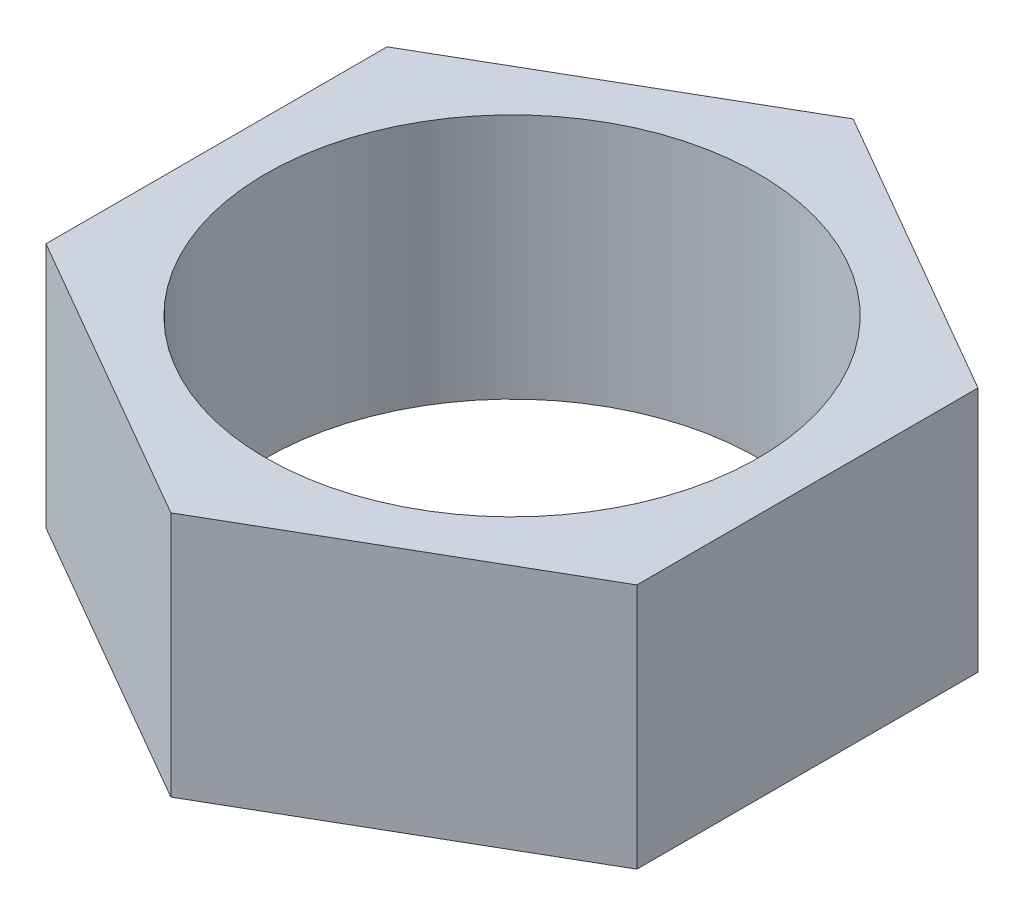
ISO-10303-21;
HEADER;
FILE_DESCRIPTION(('STEP AP214'),'2;1');
FILE_NAME('part.step','',(''),(''),'','','');
FILE_SCHEMA(('AUTOMOTIVE_DESIGN { 1 0 10303 214 1 1 1 1 }'));
ENDSEC;
DATA;
#1=APPLICATION_CONTEXT('core data for automotive mechanical design processes');
#2=APPLICATION_PROTOCOL_DEFINITION('international standard','automotive_design',2000,#1);
#3=PRODUCT_CONTEXT('',#1,'mechanical');
#4=PRODUCT('Part','Part','',(#3));
#5=PRODUCT_RELATED_PRODUCT_CATEGORY('part','',(#4));
#6=PRODUCT_DEFINITION_FORMATION('','',#4);
#7=PRODUCT_DEFINITION_CONTEXT('part definition',#1,'design');
#8=PRODUCT_DEFINITION('design','',#6,#7);
#9=PRODUCT_DEFINITION_SHAPE('','',#8);
#10=(LENGTH_UNIT() NAMED_UNIT(*) SI_UNIT(.MILLI.,.METRE.));
#11=(NAMED_UNIT(*) PLANE_ANGLE_UNIT() SI_UNIT($,.RADIAN.));
#12=(NAMED_UNIT(*) SI_UNIT($,.STERADIAN.) SOLID_ANGLE_UNIT());
#13=UNCERTAINTY_MEASURE_WITH_UNIT(LENGTH_MEASURE(1.E-05),#10,'distance_accuracy_value','');
#14=(GEOMETRIC_REPRESENTATION_CONTEXT(3) GLOBAL_UNCERTAINTY_ASSIGNED_CONTEXT((#13)) GLOBAL_UNIT_ASSIGNED_CONTEXT((#10,
#11,#12)) REPRESENTATION_CONTEXT('',''));
#15=CARTESIAN_POINT('',(0.,0.,0.));
#16=DIRECTION('',(0.,0.,1.));
#17=DIRECTION('',(1.,0.,0.));
#18=AXIS2_PLACEMENT_3D('',#15,#16,#17);
#19=CARTESIAN_POINT('',(0.,0.25,-0.346410161513775));
#20=DIRECTION('',(0.5,0.,0.866025403784439));
#21=DIRECTION('',(0.866025403784439,0.,-0.5));
#22=AXIS2_PLACEMENT_3D('',#19,#20,#21);
#23=PLANE('',#22);
#24=DIRECTION('',(-0.866025403784439,0.,0.5));
#25=VECTOR('',#24,1.);
#26=CARTESIAN_POINT('',(0.,0.,-0.346410161513775));
#27=LINE('',#26,#25);
#28=CARTESIAN_POINT('',(0.,0.,-0.346410161513775));
#29=VERTEX_POINT('',#28);
#30=CARTESIAN_POINT('',(-0.3,0.,-0.173205080756888));
#31=VERTEX_POINT('',#30);
#32=EDGE_CURVE('E117',#29,#31,#27,.T.);
#33=ORIENTED_EDGE('',*,*,#32,.T.);
#34=DIRECTION('',(0.,-1.,0.));
#35=VECTOR('',#34,1.);
#36=CARTESIAN_POINT('',(-0.3,0.25,-0.173205080756888));
#37=LINE('',#36,#35);
#38=CARTESIAN_POINT('',(-0.3,0.25,-0.173205080756888));
#39=VERTEX_POINT('',#38);
#40=EDGE_CURVE('E11',#39,#31,#37,.T.);
#41=ORIENTED_EDGE('',*,*,#40,.F.);
#42=DIRECTION('',(-0.866025403784439,0.,0.5));
#43=VECTOR('',#42,1.);
#44=CARTESIAN_POINT('',(0.,0.25,-0.346410161513775));
#45=LINE('',#44,#43);
#46=CARTESIAN_POINT('',(0.,0.25,-0.346410161513775));
#47=VERTEX_POINT('',#46);
#48=EDGE_CURVE('E128',#47,#39,#45,.T.);
#49=ORIENTED_EDGE('',*,*,#48,.F.);
#50=DIRECTION('',(0.,-1.,0.));
#51=VECTOR('',#50,1.);
#52=CARTESIAN_POINT('',(0.,0.25,-0.346410161513775));
#53=LINE('',#52,#51);
#54=EDGE_CURVE('E113',#47,#29,#53,.T.);
#55=ORIENTED_EDGE('',*,*,#54,.T.);
#56=EDGE_LOOP('',(#33,#41,#49,#55));
#57=FACE_BOUND('',#56,.T.);
#58=ADVANCED_FACE('F33',(#57),#23,.F.);
#59=CARTESIAN_POINT('',(-0.3,0.25,-0.173205080756888));
#60=DIRECTION('',(1.,0.,0.));
#61=DIRECTION('',(0.,0.,-1.));
#62=AXIS2_PLACEMENT_3D('',#59,#60,#61);
#63=PLANE('',#62);
#64=DIRECTION('',(0.,0.,1.));
#65=VECTOR('',#64,1.);
#66=CARTESIAN_POINT('',(-0.3,0.,-0.173205080756888));
#67=LINE('',#66,#65);
#68=CARTESIAN_POINT('',(-0.3,0.,0.173205080756888));
#69=VERTEX_POINT('',#68);
#70=EDGE_CURVE('E120',#31,#69,#67,.T.);
#71=ORIENTED_EDGE('',*,*,#70,.T.);
#72=DIRECTION('',(0.,-1.,0.));
#73=VECTOR('',#72,1.);
#74=CARTESIAN_POINT('',(-0.3,0.25,0.173205080756888));
#75=LINE('',#74,#73);
#76=CARTESIAN_POINT('',(-0.3,0.25,0.173205080756888));
#77=VERTEX_POINT('',#76);
#78=EDGE_CURVE('E41',#77,#69,#75,.T.);
#79=ORIENTED_EDGE('',*,*,#78,.F.);
#80=DIRECTION('',(0.,0.,1.));
#81=VECTOR('',#80,1.);
#82=CARTESIAN_POINT('',(-0.3,0.25,-0.173205080756888));
#83=LINE('',#82,#81);
#84=EDGE_CURVE('E86',#39,#77,#83,.T.);
#85=ORIENTED_EDGE('',*,*,#84,.F.);
#86=ORIENTED_EDGE('',*,*,#40,.T.);
#87=EDGE_LOOP('',(#71,#79,#85,#86));
#88=FACE_BOUND('',#87,.T.);
#89=ADVANCED_FACE('F153',(#88),#63,.F.);
#90=CARTESIAN_POINT('',(-0.3,0.25,0.173205080756888));
#91=DIRECTION('',(0.5,0.,-0.866025403784439));
#92=DIRECTION('',(-0.866025403784438,0.,-0.5));
#93=AXIS2_PLACEMENT_3D('',#90,#91,#92);
#94=PLANE('',#93);
#95=DIRECTION('',(0.866025403784438,0.,0.5));
#96=VECTOR('',#95,1.);
#97=CARTESIAN_POINT('',(-0.3,0.,0.173205080756888));
#98=LINE('',#97,#96);
#99=CARTESIAN_POINT('',(0.,0.,0.346410161513775));
#100=VERTEX_POINT('',#99);
#101=EDGE_CURVE('E123',#69,#100,#98,.T.);
#102=ORIENTED_EDGE('',*,*,#101,.T.);
#103=DIRECTION('',(0.,-1.,0.));
#104=VECTOR('',#103,1.);
#105=CARTESIAN_POINT('',(0.,0.25,0.346410161513775));
#106=LINE('',#105,#104);
#107=CARTESIAN_POINT('',(0.,0.25,0.346410161513775));
#108=VERTEX_POINT('',#107);
#109=EDGE_CURVE('E108',#108,#100,#106,.T.);
#110=ORIENTED_EDGE('',*,*,#109,.F.);
#111=DIRECTION('',(0.866025403784438,0.,0.5));
#112=VECTOR('',#111,1.);
#113=CARTESIAN_POINT('',(-0.3,0.25,0.173205080756888));
#114=LINE('',#113,#112);
#115=EDGE_CURVE('E99',#77,#108,#114,.T.);
#116=ORIENTED_EDGE('',*,*,#115,.F.);
#117=ORIENTED_EDGE('',*,*,#78,.T.);
#118=EDGE_LOOP('',(#102,#110,#116,#117));
#119=FACE_BOUND('',#118,.T.);
#120=ADVANCED_FACE('F134',(#119),#94,.F.);
#121=CARTESIAN_POINT('',(0.,0.25,0.346410161513775));
#122=DIRECTION('',(-0.5,0.,-0.866025403784438));
#123=DIRECTION('',(-0.866025403784438,0.,0.5));
#124=AXIS2_PLACEMENT_3D('',#121,#122,#123);
#125=PLANE('',#124);
#126=DIRECTION('',(0.866025403784438,0.,-0.5));
#127=VECTOR('',#126,1.);
#128=CARTESIAN_POINT('',(0.,0.,0.346410161513775));
#129=LINE('',#128,#127);
#130=CARTESIAN_POINT('',(0.3,0.,0.173205080756887));
#131=VERTEX_POINT('',#130);
#132=EDGE_CURVE('E107',#100,#131,#129,.T.);
#133=ORIENTED_EDGE('',*,*,#132,.T.);
#134=DIRECTION('',(0.,-1.,0.));
#135=VECTOR('',#134,1.);
#136=CARTESIAN_POINT('',(0.3,0.25,0.173205080756887));
#137=LINE('',#136,#135);
#138=CARTESIAN_POINT('',(0.3,0.25,0.173205080756887));
#139=VERTEX_POINT('',#138);
#140=EDGE_CURVE('E104',#139,#131,#137,.T.);
#141=ORIENTED_EDGE('',*,*,#140,.F.);
#142=DIRECTION('',(0.866025403784438,0.,-0.5));
#143=VECTOR('',#142,1.);
#144=CARTESIAN_POINT('',(0.,0.25,0.346410161513775));
#145=LINE('',#144,#143);
#146=EDGE_CURVE('E93',#108,#139,#145,.T.);
#147=ORIENTED_EDGE('',*,*,#146,.F.);
#148=ORIENTED_EDGE('',*,*,#109,.T.);
#149=EDGE_LOOP('',(#133,#141,#147,#148));
#150=FACE_BOUND('',#149,.T.);
#151=ADVANCED_FACE('F105',(#150),#125,.F.);
#152=CARTESIAN_POINT('',(0.3,0.25,0.173205080756887));
#153=DIRECTION('',(-1.,0.,0.));
#154=DIRECTION('',(0.,0.,1.));
#155=AXIS2_PLACEMENT_3D('',#152,#153,#154);
#156=PLANE('',#155);
#157=DIRECTION('',(0.,0.,-1.));
#158=VECTOR('',#157,1.);
#159=CARTESIAN_POINT('',(0.3,0.,0.173205080756887));
#160=LINE('',#159,#158);
#161=CARTESIAN_POINT('',(0.3,0.,-0.173205080756888));
#162=VERTEX_POINT('',#161);
#163=EDGE_CURVE('E72',#131,#162,#160,.T.);
#164=ORIENTED_EDGE('',*,*,#163,.T.);
#165=DIRECTION('',(0.,-1.,0.));
#166=VECTOR('',#165,1.);
#167=CARTESIAN_POINT('',(0.3,0.25,-0.173205080756888));
#168=LINE('',#167,#166);
#169=CARTESIAN_POINT('',(0.3,0.25,-0.173205080756888));
#170=VERTEX_POINT('',#169);
#171=EDGE_CURVE('E109',#170,#162,#168,.T.);
#172=ORIENTED_EDGE('',*,*,#171,.F.);
#173=DIRECTION('',(0.,0.,-1.));
#174=VECTOR('',#173,1.);
#175=CARTESIAN_POINT('',(0.3,0.25,0.173205080756887));
#176=LINE('',#175,#174);
#177=EDGE_CURVE('E97',#139,#170,#176,.T.);
#178=ORIENTED_EDGE('',*,*,#177,.F.);
#179=ORIENTED_EDGE('',*,*,#140,.T.);
#180=EDGE_LOOP('',(#164,#172,#178,#179));
#181=FACE_BOUND('',#180,.T.);
#182=ADVANCED_FACE('F111',(#181),#156,.F.);
#183=CARTESIAN_POINT('',(0.3,0.25,-0.173205080756888));
#184=DIRECTION('',(-0.5,0.,0.866025403784439));
#185=DIRECTION('',(0.866025403784439,0.,0.5));
#186=AXIS2_PLACEMENT_3D('',#183,#184,#185);
#187=PLANE('',#186);
#188=DIRECTION('',(-0.866025403784439,0.,-0.5));
#189=VECTOR('',#188,1.);
#190=CARTESIAN_POINT('',(0.3,0.,-0.173205080756888));
#191=LINE('',#190,#189);
#192=EDGE_CURVE('E78',#162,#29,#191,.T.);
#193=ORIENTED_EDGE('',*,*,#192,.T.);
#194=ORIENTED_EDGE('',*,*,#54,.F.);
#195=DIRECTION('',(-0.866025403784439,0.,-0.5));
#196=VECTOR('',#195,1.);
#197=CARTESIAN_POINT('',(0.3,0.25,-0.173205080756888));
#198=LINE('',#197,#196);
#199=EDGE_CURVE('E49',#170,#47,#198,.T.);
#200=ORIENTED_EDGE('',*,*,#199,.F.);
#201=ORIENTED_EDGE('',*,*,#171,.T.);
#202=EDGE_LOOP('',(#193,#194,#200,#201));
#203=FACE_BOUND('',#202,.T.);
#204=ADVANCED_FACE('F141',(#203),#187,.F.);
#205=CARTESIAN_POINT('',(0.,0.25,0.));
#206=DIRECTION('',(0.,1.,0.));
#207=DIRECTION('',(0.,0.,1.));
#208=AXIS2_PLACEMENT_3D('',#205,#206,#207);
#209=PLANE('',#208);
#210=CARTESIAN_POINT('',(0.,0.25,0.));
#211=DIRECTION('',(0.,1.,0.));
#212=DIRECTION('',(0.,0.,1.));
#213=AXIS2_PLACEMENT_3D('',#210,#211,#212);
#214=CIRCLE('',#213,0.25);
#215=CARTESIAN_POINT('',(0.,0.25,0.25));
#216=VERTEX_POINT('',#215);
#217=EDGE_CURVE('E208',#216,#216,#214,.T.);
#218=ORIENTED_EDGE('',*,*,#217,.F.);
#219=EDGE_LOOP('',(#218));
#220=FACE_BOUND('',#219,.T.);
#221=ORIENTED_EDGE('',*,*,#48,.T.);
#222=ORIENTED_EDGE('',*,*,#84,.T.);
#223=ORIENTED_EDGE('',*,*,#115,.T.);
#224=ORIENTED_EDGE('',*,*,#146,.T.);
#225=ORIENTED_EDGE('',*,*,#177,.T.);
#226=ORIENTED_EDGE('',*,*,#199,.T.);
#227=EDGE_LOOP('',(#221,#222,#223,#224,#225,#226));
#228=FACE_BOUND('',#227,.T.);
#229=ADVANCED_FACE('F95',(#220,#228),#209,.T.);
#230=CARTESIAN_POINT('',(0.,0.,0.));
#231=DIRECTION('',(0.,1.,0.));
#232=DIRECTION('',(0.,0.,1.));
#233=AXIS2_PLACEMENT_3D('',#230,#231,#232);
#234=PLANE('',#233);
#235=CARTESIAN_POINT('',(0.,0.,0.));
#236=DIRECTION('',(0.,1.,0.));
#237=DIRECTION('',(0.,0.,1.));
#238=AXIS2_PLACEMENT_3D('',#235,#236,#237);
#239=CIRCLE('',#238,0.25);
#240=CARTESIAN_POINT('',(0.,0.,0.25));
#241=VERTEX_POINT('',#240);
#242=EDGE_CURVE('E121',#241,#241,#239,.T.);
#243=ORIENTED_EDGE('',*,*,#242,.T.);
#244=EDGE_LOOP('',(#243));
#245=FACE_BOUND('',#244,.T.);
#246=ORIENTED_EDGE('',*,*,#32,.F.);
#247=ORIENTED_EDGE('',*,*,#192,.F.);
#248=ORIENTED_EDGE('',*,*,#163,.F.);
#249=ORIENTED_EDGE('',*,*,#132,.F.);
#250=ORIENTED_EDGE('',*,*,#101,.F.);
#251=ORIENTED_EDGE('',*,*,#70,.F.);
#252=EDGE_LOOP('',(#246,#247,#248,#249,#250,#251));
#253=FACE_BOUND('',#252,.T.);
#254=ADVANCED_FACE('F137',(#245,#253),#234,.F.);
#255=CARTESIAN_POINT('',(0.,0.,0.));
#256=DIRECTION('',(0.,1.,0.));
#257=DIRECTION('',(0.,0.,1.));
#258=AXIS2_PLACEMENT_3D('',#255,#256,#257);
#259=CYLINDRICAL_SURFACE('',#258,0.25);
#260=ORIENTED_EDGE('',*,*,#242,.F.);
#261=EDGE_LOOP('',(#260));
#262=FACE_BOUND('',#261,.T.);
#263=ORIENTED_EDGE('',*,*,#217,.T.);
#264=EDGE_LOOP('',(#263));
#265=FACE_BOUND('',#264,.T.);
#266=ADVANCED_FACE('F190',(#262,#265),#259,.F.);
#267=CLOSED_SHELL('',(#58,#89,#120,#151,#182,#204,#229,#254,#266));
#268=MANIFOLD_SOLID_BREP('B2',#267);
#269=ADVANCED_BREP_SHAPE_REPRESENTATION('',(#18,#268),#14);
#270=SHAPE_DEFINITION_REPRESENTATION(#9,#269);
ENDSEC;
END-ISO-10303-21;
